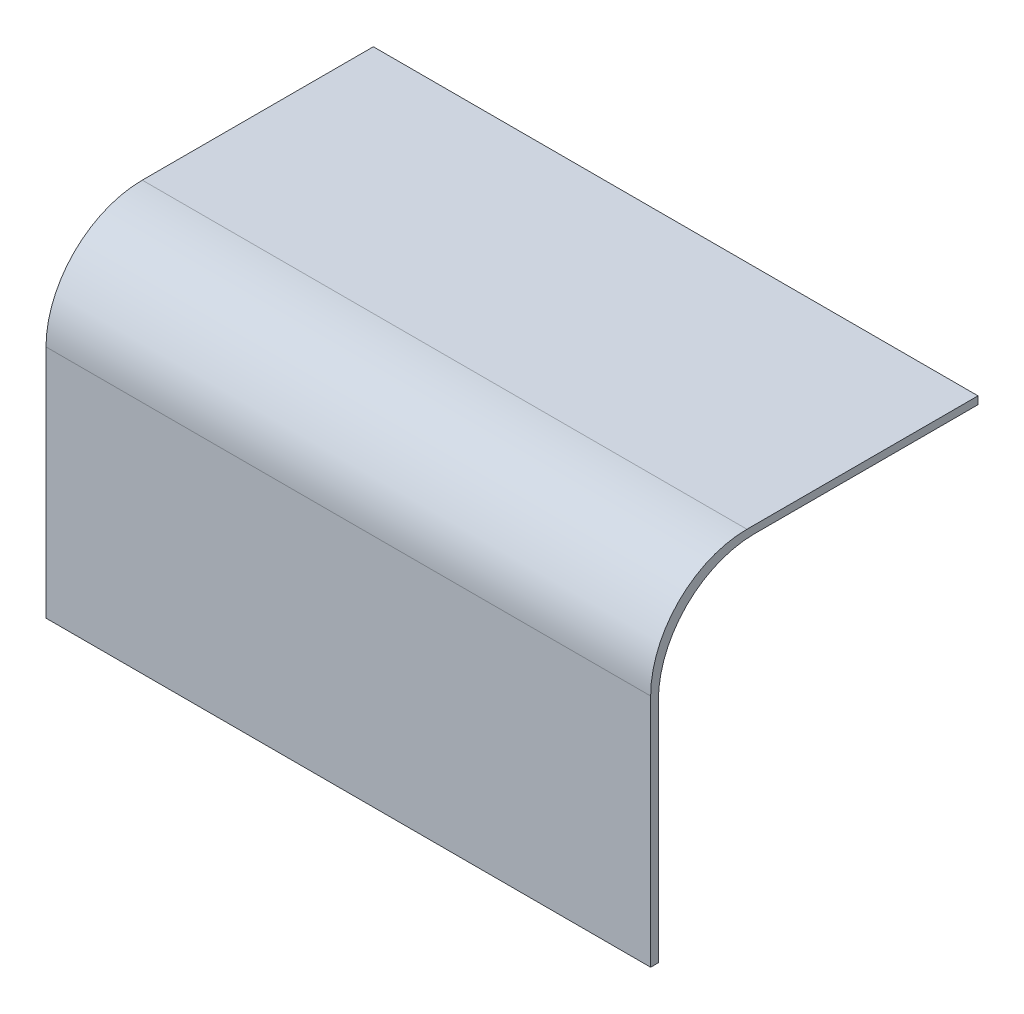
ISO-10303-21;
HEADER;
FILE_DESCRIPTION(('STEP AP214'),'2;1');
FILE_NAME('part.step','',(''),(''),'','','');
FILE_SCHEMA(('AUTOMOTIVE_DESIGN { 1 0 10303 214 1 1 1 1 }'));
ENDSEC;
DATA;
#1=APPLICATION_CONTEXT('core data for automotive mechanical design processes');
#2=APPLICATION_PROTOCOL_DEFINITION('international standard','automotive_design',2000,#1);
#3=PRODUCT_CONTEXT('',#1,'mechanical');
#4=PRODUCT('Part','Part','',(#3));
#5=PRODUCT_RELATED_PRODUCT_CATEGORY('part','',(#4));
#6=PRODUCT_DEFINITION_FORMATION('','',#4);
#7=PRODUCT_DEFINITION_CONTEXT('part definition',#1,'design');
#8=PRODUCT_DEFINITION('design','',#6,#7);
#9=PRODUCT_DEFINITION_SHAPE('','',#8);
#10=(LENGTH_UNIT() NAMED_UNIT(*) SI_UNIT(.MILLI.,.METRE.));
#11=(NAMED_UNIT(*) PLANE_ANGLE_UNIT() SI_UNIT($,.RADIAN.));
#12=(NAMED_UNIT(*) SI_UNIT($,.STERADIAN.) SOLID_ANGLE_UNIT());
#13=UNCERTAINTY_MEASURE_WITH_UNIT(LENGTH_MEASURE(1.E-05),#10,'distance_accuracy_value','');
#14=(GEOMETRIC_REPRESENTATION_CONTEXT(3) GLOBAL_UNCERTAINTY_ASSIGNED_CONTEXT((#13)) GLOBAL_UNIT_ASSIGNED_CONTEXT((#10,
#11,#12)) REPRESENTATION_CONTEXT('',''));
#15=CARTESIAN_POINT('',(0.,0.,0.));
#16=DIRECTION('',(0.,0.,1.));
#17=DIRECTION('',(1.,0.,0.));
#18=AXIS2_PLACEMENT_3D('',#15,#16,#17);
#19=CARTESIAN_POINT('',(-314.,97.591108672951,34.5721235394558));
#20=DIRECTION('',(0.,0.,-1.));
#21=DIRECTION('',(0.,1.,0.));
#22=AXIS2_PLACEMENT_3D('',#19,#20,#21);
#23=PLANE('',#22);
#24=DIRECTION('',(0.,1.,0.));
#25=VECTOR('',#24,1.);
#26=CARTESIAN_POINT('',(-5.99999999999998,-14.408891327049,34.5721235394558));
#27=LINE('',#26,#25);
#28=CARTESIAN_POINT('',(-5.99999999999998,-14.408891327049,34.5721235394558));
#29=VERTEX_POINT('',#28);
#30=CARTESIAN_POINT('',(-5.99999999999998,97.591108672951,34.5721235394558));
#31=VERTEX_POINT('',#30);
#32=EDGE_CURVE('E361',#29,#31,#27,.T.);
#33=ORIENTED_EDGE('',*,*,#32,.F.);
#34=DIRECTION('',(1.,0.,0.));
#35=VECTOR('',#34,1.);
#36=CARTESIAN_POINT('',(-308.,-14.408891327049,34.5721235394558));
#37=LINE('',#36,#35);
#38=CARTESIAN_POINT('',(-308.,-14.408891327049,34.5721235394558));
#39=VERTEX_POINT('',#38);
#40=EDGE_CURVE('E366',#39,#29,#37,.T.);
#41=ORIENTED_EDGE('',*,*,#40,.F.);
#42=DIRECTION('',(0.,-1.,0.));
#43=VECTOR('',#42,1.);
#44=CARTESIAN_POINT('',(-308.,97.591108672951,34.5721235394558));
#45=LINE('',#44,#43);
#46=CARTESIAN_POINT('',(-308.,97.591108672951,34.5721235394558));
#47=VERTEX_POINT('',#46);
#48=EDGE_CURVE('E396',#47,#39,#45,.T.);
#49=ORIENTED_EDGE('',*,*,#48,.F.);
#50=DIRECTION('',(1.,0.,0.));
#51=VECTOR('',#50,1.);
#52=CARTESIAN_POINT('',(-314.,97.591108672951,34.5721235394558));
#53=LINE('',#52,#51);
#54=EDGE_CURVE('E179',#47,#31,#53,.T.);
#55=ORIENTED_EDGE('',*,*,#54,.T.);
#56=EDGE_LOOP('',(#33,#41,#49,#55));
#57=FACE_BOUND('',#56,.T.);
#58=ADVANCED_FACE('F38',(#57),#23,.T.);
#59=CARTESIAN_POINT('',(-314.,-20.408891327049,34.5721235394558));
#60=DIRECTION('',(0.,-1.,0.));
#61=DIRECTION('',(0.,0.,-1.));
#62=AXIS2_PLACEMENT_3D('',#59,#60,#61);
#63=PLANE('',#62);
#64=DIRECTION('',(0.,0.,-1.));
#65=VECTOR('',#64,1.);
#66=CARTESIAN_POINT('',(0.,-20.408891327049,34.5721235394558));
#67=LINE('',#66,#65);
#68=CARTESIAN_POINT('',(0.,-20.408891327049,38.5721235394558));
#69=VERTEX_POINT('',#68);
#70=CARTESIAN_POINT('',(0.,-20.408891327049,34.5721235394558));
#71=VERTEX_POINT('',#70);
#72=EDGE_CURVE('E149',#69,#71,#67,.T.);
#73=ORIENTED_EDGE('',*,*,#72,.F.);
#74=DIRECTION('',(1.,0.,0.));
#75=VECTOR('',#74,1.);
#76=CARTESIAN_POINT('',(-314.,-20.408891327049,38.5721235394558));
#77=LINE('',#76,#75);
#78=CARTESIAN_POINT('',(-314.,-20.408891327049,38.5721235394558));
#79=VERTEX_POINT('',#78);
#80=EDGE_CURVE('E11',#79,#69,#77,.T.);
#81=ORIENTED_EDGE('',*,*,#80,.F.);
#82=DIRECTION('',(0.,0.,-1.));
#83=VECTOR('',#82,1.);
#84=CARTESIAN_POINT('',(-314.,-20.408891327049,34.5721235394558));
#85=LINE('',#84,#83);
#86=CARTESIAN_POINT('',(-314.,-20.408891327049,34.5721235394558));
#87=VERTEX_POINT('',#86);
#88=EDGE_CURVE('E170',#79,#87,#85,.T.);
#89=ORIENTED_EDGE('',*,*,#88,.T.);
#90=DIRECTION('',(1.,0.,0.));
#91=VECTOR('',#90,1.);
#92=CARTESIAN_POINT('',(-314.,-20.408891327049,34.5721235394558));
#93=LINE('',#92,#91);
#94=EDGE_CURVE('E42',#87,#71,#93,.T.);
#95=ORIENTED_EDGE('',*,*,#94,.T.);
#96=EDGE_LOOP('',(#73,#81,#89,#95));
#97=FACE_BOUND('',#96,.T.);
#98=ADVANCED_FACE('F40',(#97),#63,.T.);
#99=CARTESIAN_POINT('',(-314.,-20.408891327049,38.5721235394558));
#100=DIRECTION('',(0.,0.,1.));
#101=DIRECTION('',(1.,0.,0.));
#102=AXIS2_PLACEMENT_3D('',#99,#100,#101);
#103=PLANE('',#102);
#104=DIRECTION('',(0.,-1.,0.));
#105=VECTOR('',#104,1.);
#106=CARTESIAN_POINT('',(0.,-20.408891327049,38.5721235394558));
#107=LINE('',#106,#105);
#108=CARTESIAN_POINT('',(0.,101.591108672951,38.5721235394558));
#109=VERTEX_POINT('',#108);
#110=EDGE_CURVE('E168',#109,#69,#107,.T.);
#111=ORIENTED_EDGE('',*,*,#110,.F.);
#112=DIRECTION('',(1.,0.,0.));
#113=VECTOR('',#112,1.);
#114=CARTESIAN_POINT('',(-314.,101.591108672951,38.5721235394558));
#115=LINE('',#114,#113);
#116=CARTESIAN_POINT('',(-314.,101.591108672951,38.5721235394558));
#117=VERTEX_POINT('',#116);
#118=EDGE_CURVE('E47',#117,#109,#115,.T.);
#119=ORIENTED_EDGE('',*,*,#118,.F.);
#120=DIRECTION('',(0.,-1.,0.));
#121=VECTOR('',#120,1.);
#122=CARTESIAN_POINT('',(-314.,-20.408891327049,38.5721235394558));
#123=LINE('',#122,#121);
#124=EDGE_CURVE('E139',#117,#79,#123,.T.);
#125=ORIENTED_EDGE('',*,*,#124,.T.);
#126=ORIENTED_EDGE('',*,*,#80,.T.);
#127=EDGE_LOOP('',(#111,#119,#125,#126));
#128=FACE_BOUND('',#127,.T.);
#129=ADVANCED_FACE('F190',(#128),#103,.T.);
#130=CARTESIAN_POINT('',(-314.,101.591108672951,-11.4278764605442));
#131=DIRECTION('',(1.,0.,0.));
#132=DIRECTION('',(0.,0.,-1.));
#133=AXIS2_PLACEMENT_3D('',#130,#131,#132);
#134=CYLINDRICAL_SURFACE('',#133,50.);
#135=CARTESIAN_POINT('',(0.,101.591108672951,-11.4278764605442));
#136=DIRECTION('',(1.,0.,0.));
#137=DIRECTION('',(0.,0.,1.));
#138=AXIS2_PLACEMENT_3D('',#135,#136,#137);
#139=CIRCLE('',#138,50.);
#140=CARTESIAN_POINT('',(0.,151.591108672951,-11.4278764605442));
#141=VERTEX_POINT('',#140);
#142=EDGE_CURVE('E126',#141,#109,#139,.T.);
#143=ORIENTED_EDGE('',*,*,#142,.F.);
#144=DIRECTION('',(1.,0.,0.));
#145=VECTOR('',#144,1.);
#146=CARTESIAN_POINT('',(-314.,151.591108672951,-11.4278764605442));
#147=LINE('',#146,#145);
#148=CARTESIAN_POINT('',(-314.,151.591108672951,-11.4278764605442));
#149=VERTEX_POINT('',#148);
#150=EDGE_CURVE('E120',#149,#141,#147,.T.);
#151=ORIENTED_EDGE('',*,*,#150,.F.);
#152=CARTESIAN_POINT('',(-314.,101.591108672951,-11.4278764605442));
#153=DIRECTION('',(1.,0.,0.));
#154=DIRECTION('',(0.,0.,1.));
#155=AXIS2_PLACEMENT_3D('',#152,#153,#154);
#156=CIRCLE('',#155,50.);
#157=EDGE_CURVE('E123',#149,#117,#156,.T.);
#158=ORIENTED_EDGE('',*,*,#157,.T.);
#159=ORIENTED_EDGE('',*,*,#118,.T.);
#160=EDGE_LOOP('',(#143,#151,#158,#159));
#161=FACE_BOUND('',#160,.T.);
#162=ADVANCED_FACE('F122',(#161),#134,.T.);
#163=CARTESIAN_POINT('',(-314.,151.591108672951,-11.4278764605442));
#164=DIRECTION('',(0.,1.,0.));
#165=DIRECTION('',(0.,0.,1.));
#166=AXIS2_PLACEMENT_3D('',#163,#164,#165);
#167=PLANE('',#166);
#168=DIRECTION('',(0.,0.,1.));
#169=VECTOR('',#168,1.);
#170=CARTESIAN_POINT('',(0.,151.591108672951,-11.4278764605442));
#171=LINE('',#170,#169);
#172=CARTESIAN_POINT('',(0.,151.591108672951,-131.427876460544));
#173=VERTEX_POINT('',#172);
#174=EDGE_CURVE('E165',#173,#141,#171,.T.);
#175=ORIENTED_EDGE('',*,*,#174,.F.);
#176=DIRECTION('',(1.,0.,0.));
#177=VECTOR('',#176,1.);
#178=CARTESIAN_POINT('',(-314.,151.591108672951,-131.427876460544));
#179=LINE('',#178,#177);
#180=CARTESIAN_POINT('',(-314.,151.591108672951,-131.427876460544));
#181=VERTEX_POINT('',#180);
#182=EDGE_CURVE('E131',#181,#173,#179,.T.);
#183=ORIENTED_EDGE('',*,*,#182,.F.);
#184=DIRECTION('',(0.,0.,1.));
#185=VECTOR('',#184,1.);
#186=CARTESIAN_POINT('',(-314.,151.591108672951,-11.4278764605442));
#187=LINE('',#186,#185);
#188=EDGE_CURVE('E137',#181,#149,#187,.T.);
#189=ORIENTED_EDGE('',*,*,#188,.T.);
#190=ORIENTED_EDGE('',*,*,#150,.T.);
#191=EDGE_LOOP('',(#175,#183,#189,#190));
#192=FACE_BOUND('',#191,.T.);
#193=ADVANCED_FACE('F141',(#192),#167,.T.);
#194=CARTESIAN_POINT('',(-314.,151.591108672951,-131.427876460544));
#195=DIRECTION('',(0.,0.,-1.));
#196=DIRECTION('',(-1.,0.,0.));
#197=AXIS2_PLACEMENT_3D('',#194,#195,#196);
#198=PLANE('',#197);
#199=DIRECTION('',(0.,1.,0.));
#200=VECTOR('',#199,1.);
#201=CARTESIAN_POINT('',(0.,151.591108672951,-131.427876460544));
#202=LINE('',#201,#200);
#203=CARTESIAN_POINT('',(0.,147.591108672951,-131.427876460544));
#204=VERTEX_POINT('',#203);
#205=EDGE_CURVE('E162',#204,#173,#202,.T.);
#206=ORIENTED_EDGE('',*,*,#205,.F.);
#207=DIRECTION('',(1.,0.,0.));
#208=VECTOR('',#207,1.);
#209=CARTESIAN_POINT('',(-314.,147.591108672951,-131.427876460544));
#210=LINE('',#209,#208);
#211=CARTESIAN_POINT('',(-314.,147.591108672951,-131.427876460544));
#212=VERTEX_POINT('',#211);
#213=EDGE_CURVE('E174',#212,#204,#210,.T.);
#214=ORIENTED_EDGE('',*,*,#213,.F.);
#215=DIRECTION('',(0.,1.,0.));
#216=VECTOR('',#215,1.);
#217=CARTESIAN_POINT('',(-314.,151.591108672951,-131.427876460544));
#218=LINE('',#217,#216);
#219=EDGE_CURVE('E142',#212,#181,#218,.T.);
#220=ORIENTED_EDGE('',*,*,#219,.T.);
#221=ORIENTED_EDGE('',*,*,#182,.T.);
#222=EDGE_LOOP('',(#206,#214,#220,#221));
#223=FACE_BOUND('',#222,.T.);
#224=ADVANCED_FACE('F219',(#223),#198,.T.);
#225=CARTESIAN_POINT('',(-314.,147.591108672951,-131.427876460544));
#226=DIRECTION('',(0.,-1.,0.));
#227=DIRECTION('',(0.,0.,-1.));
#228=AXIS2_PLACEMENT_3D('',#225,#226,#227);
#229=PLANE('',#228);
#230=DIRECTION('',(0.,0.,-1.));
#231=VECTOR('',#230,1.);
#232=CARTESIAN_POINT('',(0.,147.591108672951,-131.427876460544));
#233=LINE('',#232,#231);
#234=CARTESIAN_POINT('',(0.,147.591108672951,-15.4278764605442));
#235=VERTEX_POINT('',#234);
#236=EDGE_CURVE('E159',#235,#204,#233,.T.);
#237=ORIENTED_EDGE('',*,*,#236,.F.);
#238=DIRECTION('',(1.,0.,0.));
#239=VECTOR('',#238,1.);
#240=CARTESIAN_POINT('',(-314.,147.591108672951,-15.4278764605442));
#241=LINE('',#240,#239);
#242=CARTESIAN_POINT('',(-314.,147.591108672951,-15.4278764605442));
#243=VERTEX_POINT('',#242);
#244=EDGE_CURVE('E176',#243,#235,#241,.T.);
#245=ORIENTED_EDGE('',*,*,#244,.F.);
#246=DIRECTION('',(0.,0.,-1.));
#247=VECTOR('',#246,1.);
#248=CARTESIAN_POINT('',(-314.,147.591108672951,-131.427876460544));
#249=LINE('',#248,#247);
#250=EDGE_CURVE('E144',#243,#212,#249,.T.);
#251=ORIENTED_EDGE('',*,*,#250,.T.);
#252=ORIENTED_EDGE('',*,*,#213,.T.);
#253=EDGE_LOOP('',(#237,#245,#251,#252));
#254=FACE_BOUND('',#253,.T.);
#255=ADVANCED_FACE('F214',(#254),#229,.T.);
#256=CARTESIAN_POINT('',(-314.,97.591108672951,-15.4278764605442));
#257=DIRECTION('',(1.,0.,0.));
#258=DIRECTION('',(0.,0.,-1.));
#259=AXIS2_PLACEMENT_3D('',#256,#257,#258);
#260=CYLINDRICAL_SURFACE('',#259,50.);
#261=CARTESIAN_POINT('',(0.,97.591108672951,-15.4278764605442));
#262=DIRECTION('',(-1.,0.,0.));
#263=DIRECTION('',(0.,0.,-1.));
#264=AXIS2_PLACEMENT_3D('',#261,#262,#263);
#265=CIRCLE('',#264,50.);
#266=CARTESIAN_POINT('',(0.,97.591108672951,34.5721235394558));
#267=VERTEX_POINT('',#266);
#268=EDGE_CURVE('E156',#267,#235,#265,.T.);
#269=ORIENTED_EDGE('',*,*,#268,.F.);
#270=CARTESIAN_POINT('',(-2.,97.591108672951,34.5721235394558));
#271=VERTEX_POINT('',#270);
#272=EDGE_CURVE('E180',#271,#267,#53,.T.);
#273=ORIENTED_EDGE('',*,*,#272,.F.);
#274=DIRECTION('',(1.,0.,0.));
#275=VECTOR('',#274,1.);
#276=CARTESIAN_POINT('',(-5.99999999999998,97.591108672951,34.5721235394558));
#277=LINE('',#276,#275);
#278=EDGE_CURVE('E55',#31,#271,#277,.T.);
#279=ORIENTED_EDGE('',*,*,#278,.F.);
#280=ORIENTED_EDGE('',*,*,#54,.F.);
#281=DIRECTION('',(1.,0.,0.));
#282=VECTOR('',#281,1.);
#283=CARTESIAN_POINT('',(-312.,97.591108672951,34.5721235394558));
#284=LINE('',#283,#282);
#285=CARTESIAN_POINT('',(-312.,97.591108672951,34.5721235394558));
#286=VERTEX_POINT('',#285);
#287=EDGE_CURVE('E393',#286,#47,#284,.T.);
#288=ORIENTED_EDGE('',*,*,#287,.F.);
#289=CARTESIAN_POINT('',(-314.,97.591108672951,34.5721235394558));
#290=VERTEX_POINT('',#289);
#291=EDGE_CURVE('E177',#290,#286,#53,.T.);
#292=ORIENTED_EDGE('',*,*,#291,.F.);
#293=CARTESIAN_POINT('',(-314.,97.591108672951,-15.4278764605442));
#294=DIRECTION('',(-1.,0.,0.));
#295=DIRECTION('',(0.,0.,-1.));
#296=AXIS2_PLACEMENT_3D('',#293,#294,#295);
#297=CIRCLE('',#296,50.);
#298=EDGE_CURVE('E424',#290,#243,#297,.T.);
#299=ORIENTED_EDGE('',*,*,#298,.T.);
#300=ORIENTED_EDGE('',*,*,#244,.T.);
#301=EDGE_LOOP('',(#269,#273,#279,#280,#288,#292,#299,#300));
#302=FACE_BOUND('',#301,.T.);
#303=ADVANCED_FACE('F208',(#302),#260,.F.);
#304=DIRECTION('',(0.,1.,0.));
#305=VECTOR('',#304,1.);
#306=CARTESIAN_POINT('',(-312.,-18.408891327049,34.5721235394558));
#307=LINE('',#306,#305);
#308=CARTESIAN_POINT('',(-312.,-18.408891327049,34.5721235394558));
#309=VERTEX_POINT('',#308);
#310=EDGE_CURVE('E390',#309,#286,#307,.T.);
#311=ORIENTED_EDGE('',*,*,#310,.F.);
#312=DIRECTION('',(-1.,0.,0.));
#313=VECTOR('',#312,1.);
#314=CARTESIAN_POINT('',(-2.,-18.408891327049,34.5721235394558));
#315=LINE('',#314,#313);
#316=CARTESIAN_POINT('',(-2.,-18.408891327049,34.5721235394558));
#317=VERTEX_POINT('',#316);
#318=EDGE_CURVE('E387',#317,#309,#315,.T.);
#319=ORIENTED_EDGE('',*,*,#318,.F.);
#320=DIRECTION('',(0.,-1.,0.));
#321=VECTOR('',#320,1.);
#322=CARTESIAN_POINT('',(-1.99999999999998,97.591108672951,34.5721235394558));
#323=LINE('',#322,#321);
#324=EDGE_CURVE('E384',#271,#317,#323,.T.);
#325=ORIENTED_EDGE('',*,*,#324,.F.);
#326=ORIENTED_EDGE('',*,*,#272,.T.);
#327=DIRECTION('',(0.,1.,0.));
#328=VECTOR('',#327,1.);
#329=CARTESIAN_POINT('',(0.,97.591108672951,34.5721235394558));
#330=LINE('',#329,#328);
#331=EDGE_CURVE('E152',#71,#267,#330,.T.);
#332=ORIENTED_EDGE('',*,*,#331,.F.);
#333=ORIENTED_EDGE('',*,*,#94,.F.);
#334=DIRECTION('',(0.,1.,0.));
#335=VECTOR('',#334,1.);
#336=CARTESIAN_POINT('',(-314.,97.591108672951,34.5721235394558));
#337=LINE('',#336,#335);
#338=EDGE_CURVE('E422',#87,#290,#337,.T.);
#339=ORIENTED_EDGE('',*,*,#338,.T.);
#340=ORIENTED_EDGE('',*,*,#291,.T.);
#341=EDGE_LOOP('',(#311,#319,#325,#326,#332,#333,#339,#340));
#342=FACE_BOUND('',#341,.T.);
#343=ADVANCED_FACE('F187',(#342),#23,.T.);
#344=CARTESIAN_POINT('',(-314.,101.591108672951,-11.4278764605442));
#345=DIRECTION('',(-1.,0.,0.));
#346=DIRECTION('',(0.,0.,1.));
#347=AXIS2_PLACEMENT_3D('',#344,#345,#346);
#348=PLANE('',#347);
#349=ORIENTED_EDGE('',*,*,#88,.F.);
#350=ORIENTED_EDGE('',*,*,#124,.F.);
#351=ORIENTED_EDGE('',*,*,#157,.F.);
#352=ORIENTED_EDGE('',*,*,#188,.F.);
#353=ORIENTED_EDGE('',*,*,#219,.F.);
#354=ORIENTED_EDGE('',*,*,#250,.F.);
#355=ORIENTED_EDGE('',*,*,#298,.F.);
#356=ORIENTED_EDGE('',*,*,#338,.F.);
#357=EDGE_LOOP('',(#349,#350,#351,#352,#353,#354,#355,#356));
#358=FACE_BOUND('',#357,.T.);
#359=ADVANCED_FACE('F135',(#358),#348,.T.);
#360=CARTESIAN_POINT('',(0.,101.591108672951,-11.4278764605442));
#361=DIRECTION('',(-1.,0.,0.));
#362=DIRECTION('',(0.,0.,1.));
#363=AXIS2_PLACEMENT_3D('',#360,#361,#362);
#364=PLANE('',#363);
#365=ORIENTED_EDGE('',*,*,#72,.T.);
#366=ORIENTED_EDGE('',*,*,#331,.T.);
#367=ORIENTED_EDGE('',*,*,#268,.T.);
#368=ORIENTED_EDGE('',*,*,#236,.T.);
#369=ORIENTED_EDGE('',*,*,#205,.T.);
#370=ORIENTED_EDGE('',*,*,#174,.T.);
#371=ORIENTED_EDGE('',*,*,#142,.T.);
#372=ORIENTED_EDGE('',*,*,#110,.T.);
#373=EDGE_LOOP('',(#365,#366,#367,#368,#369,#370,#371,#372));
#374=FACE_BOUND('',#373,.T.);
#375=ADVANCED_FACE('F189',(#374),#364,.F.);
#376=CARTESIAN_POINT('',(-5.99999999999998,97.591108672951,36.5721235394558));
#377=DIRECTION('',(0.,1.,0.));
#378=DIRECTION('',(0.,0.,1.));
#379=AXIS2_PLACEMENT_3D('',#376,#377,#378);
#380=PLANE('',#379);
#381=ORIENTED_EDGE('',*,*,#278,.T.);
#382=DIRECTION('',(0.,0.,-1.));
#383=VECTOR('',#382,1.);
#384=CARTESIAN_POINT('',(-1.99999999999998,97.591108672951,36.5721235394558));
#385=LINE('',#384,#383);
#386=CARTESIAN_POINT('',(-1.99999999999998,97.591108672951,36.5721235394558));
#387=VERTEX_POINT('',#386);
#388=EDGE_CURVE('E382',#387,#271,#385,.T.);
#389=ORIENTED_EDGE('',*,*,#388,.F.);
#390=DIRECTION('',(1.,0.,0.));
#391=VECTOR('',#390,1.);
#392=CARTESIAN_POINT('',(-5.99999999999998,97.591108672951,36.5721235394558));
#393=LINE('',#392,#391);
#394=CARTESIAN_POINT('',(-5.99999999999998,97.591108672951,36.5721235394558));
#395=VERTEX_POINT('',#394);
#396=EDGE_CURVE('E352',#395,#387,#393,.T.);
#397=ORIENTED_EDGE('',*,*,#396,.F.);
#398=DIRECTION('',(0.,0.,-1.));
#399=VECTOR('',#398,1.);
#400=CARTESIAN_POINT('',(-5.99999999999998,97.591108672951,36.5721235394558));
#401=LINE('',#400,#399);
#402=EDGE_CURVE('E153',#395,#31,#401,.T.);
#403=ORIENTED_EDGE('',*,*,#402,.T.);
#404=EDGE_LOOP('',(#381,#389,#397,#403));
#405=FACE_BOUND('',#404,.T.);
#406=ADVANCED_FACE('F251',(#405),#380,.F.);
#407=CARTESIAN_POINT('',(-5.99999999999998,-14.408891327049,36.5721235394558));
#408=DIRECTION('',(-1.,0.,0.));
#409=DIRECTION('',(0.,0.,1.));
#410=AXIS2_PLACEMENT_3D('',#407,#408,#409);
#411=PLANE('',#410);
#412=ORIENTED_EDGE('',*,*,#32,.T.);
#413=ORIENTED_EDGE('',*,*,#402,.F.);
#414=DIRECTION('',(0.,1.,0.));
#415=VECTOR('',#414,1.);
#416=CARTESIAN_POINT('',(-5.99999999999998,-14.408891327049,36.5721235394558));
#417=LINE('',#416,#415);
#418=CARTESIAN_POINT('',(-5.99999999999998,-14.408891327049,36.5721235394558));
#419=VERTEX_POINT('',#418);
#420=EDGE_CURVE('E359',#419,#395,#417,.T.);
#421=ORIENTED_EDGE('',*,*,#420,.F.);
#422=DIRECTION('',(0.,0.,-1.));
#423=VECTOR('',#422,1.);
#424=CARTESIAN_POINT('',(-5.99999999999998,-14.408891327049,36.5721235394558));
#425=LINE('',#424,#423);
#426=EDGE_CURVE('E402',#419,#29,#425,.T.);
#427=ORIENTED_EDGE('',*,*,#426,.T.);
#428=EDGE_LOOP('',(#412,#413,#421,#427));
#429=FACE_BOUND('',#428,.T.);
#430=ADVANCED_FACE('F265',(#429),#411,.F.);
#431=CARTESIAN_POINT('',(-308.,-14.408891327049,36.5721235394558));
#432=DIRECTION('',(0.,1.,0.));
#433=DIRECTION('',(-1.,0.,0.));
#434=AXIS2_PLACEMENT_3D('',#431,#432,#433);
#435=PLANE('',#434);
#436=ORIENTED_EDGE('',*,*,#40,.T.);
#437=ORIENTED_EDGE('',*,*,#426,.F.);
#438=DIRECTION('',(1.,0.,0.));
#439=VECTOR('',#438,1.);
#440=CARTESIAN_POINT('',(-308.,-14.408891327049,36.5721235394558));
#441=LINE('',#440,#439);
#442=CARTESIAN_POINT('',(-308.,-14.408891327049,36.5721235394558));
#443=VERTEX_POINT('',#442);
#444=EDGE_CURVE('E379',#443,#419,#441,.T.);
#445=ORIENTED_EDGE('',*,*,#444,.F.);
#446=DIRECTION('',(0.,0.,-1.));
#447=VECTOR('',#446,1.);
#448=CARTESIAN_POINT('',(-308.,-14.408891327049,36.5721235394558));
#449=LINE('',#448,#447);
#450=EDGE_CURVE('E405',#443,#39,#449,.T.);
#451=ORIENTED_EDGE('',*,*,#450,.T.);
#452=EDGE_LOOP('',(#436,#437,#445,#451));
#453=FACE_BOUND('',#452,.T.);
#454=ADVANCED_FACE('F274',(#453),#435,.F.);
#455=CARTESIAN_POINT('',(-308.,97.591108672951,36.5721235394558));
#456=DIRECTION('',(1.,0.,0.));
#457=DIRECTION('',(0.,0.,-1.));
#458=AXIS2_PLACEMENT_3D('',#455,#456,#457);
#459=PLANE('',#458);
#460=ORIENTED_EDGE('',*,*,#48,.T.);
#461=ORIENTED_EDGE('',*,*,#450,.F.);
#462=DIRECTION('',(0.,-1.,0.));
#463=VECTOR('',#462,1.);
#464=CARTESIAN_POINT('',(-308.,97.591108672951,36.5721235394558));
#465=LINE('',#464,#463);
#466=CARTESIAN_POINT('',(-308.,97.591108672951,36.5721235394558));
#467=VERTEX_POINT('',#466);
#468=EDGE_CURVE('E376',#467,#443,#465,.T.);
#469=ORIENTED_EDGE('',*,*,#468,.F.);
#470=DIRECTION('',(0.,0.,-1.));
#471=VECTOR('',#470,1.);
#472=CARTESIAN_POINT('',(-308.,97.591108672951,36.5721235394558));
#473=LINE('',#472,#471);
#474=EDGE_CURVE('E408',#467,#47,#473,.T.);
#475=ORIENTED_EDGE('',*,*,#474,.T.);
#476=EDGE_LOOP('',(#460,#461,#469,#475));
#477=FACE_BOUND('',#476,.T.);
#478=ADVANCED_FACE('F284',(#477),#459,.F.);
#479=CARTESIAN_POINT('',(-312.,97.591108672951,36.5721235394558));
#480=DIRECTION('',(0.,1.,0.));
#481=DIRECTION('',(-1.,0.,0.));
#482=AXIS2_PLACEMENT_3D('',#479,#480,#481);
#483=PLANE('',#482);
#484=ORIENTED_EDGE('',*,*,#287,.T.);
#485=ORIENTED_EDGE('',*,*,#474,.F.);
#486=DIRECTION('',(1.,0.,0.));
#487=VECTOR('',#486,1.);
#488=CARTESIAN_POINT('',(-312.,97.591108672951,36.5721235394558));
#489=LINE('',#488,#487);
#490=CARTESIAN_POINT('',(-312.,97.591108672951,36.5721235394558));
#491=VERTEX_POINT('',#490);
#492=EDGE_CURVE('E373',#491,#467,#489,.T.);
#493=ORIENTED_EDGE('',*,*,#492,.F.);
#494=DIRECTION('',(0.,0.,-1.));
#495=VECTOR('',#494,1.);
#496=CARTESIAN_POINT('',(-312.,97.591108672951,36.5721235394558));
#497=LINE('',#496,#495);
#498=EDGE_CURVE('E411',#491,#286,#497,.T.);
#499=ORIENTED_EDGE('',*,*,#498,.T.);
#500=EDGE_LOOP('',(#484,#485,#493,#499));
#501=FACE_BOUND('',#500,.T.);
#502=ADVANCED_FACE('F294',(#501),#483,.F.);
#503=CARTESIAN_POINT('',(-312.,-18.408891327049,36.5721235394558));
#504=DIRECTION('',(-1.,0.,0.));
#505=DIRECTION('',(0.,0.,1.));
#506=AXIS2_PLACEMENT_3D('',#503,#504,#505);
#507=PLANE('',#506);
#508=ORIENTED_EDGE('',*,*,#310,.T.);
#509=ORIENTED_EDGE('',*,*,#498,.F.);
#510=DIRECTION('',(0.,1.,0.));
#511=VECTOR('',#510,1.);
#512=CARTESIAN_POINT('',(-312.,-18.408891327049,36.5721235394558));
#513=LINE('',#512,#511);
#514=CARTESIAN_POINT('',(-312.,-18.408891327049,36.5721235394558));
#515=VERTEX_POINT('',#514);
#516=EDGE_CURVE('E370',#515,#491,#513,.T.);
#517=ORIENTED_EDGE('',*,*,#516,.F.);
#518=DIRECTION('',(0.,0.,-1.));
#519=VECTOR('',#518,1.);
#520=CARTESIAN_POINT('',(-312.,-18.408891327049,36.5721235394558));
#521=LINE('',#520,#519);
#522=EDGE_CURVE('E414',#515,#309,#521,.T.);
#523=ORIENTED_EDGE('',*,*,#522,.T.);
#524=EDGE_LOOP('',(#508,#509,#517,#523));
#525=FACE_BOUND('',#524,.T.);
#526=ADVANCED_FACE('F304',(#525),#507,.F.);
#527=CARTESIAN_POINT('',(-2.,-18.408891327049,36.5721235394558));
#528=DIRECTION('',(0.,-1.,0.));
#529=DIRECTION('',(0.,0.,-1.));
#530=AXIS2_PLACEMENT_3D('',#527,#528,#529);
#531=PLANE('',#530);
#532=ORIENTED_EDGE('',*,*,#318,.T.);
#533=ORIENTED_EDGE('',*,*,#522,.F.);
#534=DIRECTION('',(-1.,0.,0.));
#535=VECTOR('',#534,1.);
#536=CARTESIAN_POINT('',(-2.,-18.408891327049,36.5721235394558));
#537=LINE('',#536,#535);
#538=CARTESIAN_POINT('',(-2.,-18.408891327049,36.5721235394558));
#539=VERTEX_POINT('',#538);
#540=EDGE_CURVE('E363',#539,#515,#537,.T.);
#541=ORIENTED_EDGE('',*,*,#540,.F.);
#542=DIRECTION('',(0.,0.,-1.));
#543=VECTOR('',#542,1.);
#544=CARTESIAN_POINT('',(-2.,-18.408891327049,36.5721235394558));
#545=LINE('',#544,#543);
#546=EDGE_CURVE('E417',#539,#317,#545,.T.);
#547=ORIENTED_EDGE('',*,*,#546,.T.);
#548=EDGE_LOOP('',(#532,#533,#541,#547));
#549=FACE_BOUND('',#548,.T.);
#550=ADVANCED_FACE('F314',(#549),#531,.F.);
#551=CARTESIAN_POINT('',(-1.99999999999998,97.591108672951,36.5721235394558));
#552=DIRECTION('',(1.,0.,0.));
#553=DIRECTION('',(0.,1.,0.));
#554=AXIS2_PLACEMENT_3D('',#551,#552,#553);
#555=PLANE('',#554);
#556=ORIENTED_EDGE('',*,*,#324,.T.);
#557=ORIENTED_EDGE('',*,*,#546,.F.);
#558=DIRECTION('',(0.,-1.,0.));
#559=VECTOR('',#558,1.);
#560=CARTESIAN_POINT('',(-1.99999999999998,97.591108672951,36.5721235394558));
#561=LINE('',#560,#559);
#562=EDGE_CURVE('E356',#387,#539,#561,.T.);
#563=ORIENTED_EDGE('',*,*,#562,.F.);
#564=ORIENTED_EDGE('',*,*,#388,.T.);
#565=EDGE_LOOP('',(#556,#557,#563,#564));
#566=FACE_BOUND('',#565,.T.);
#567=ADVANCED_FACE('F324',(#566),#555,.F.);
#568=CARTESIAN_POINT('',(0.,0.,36.5721235394558));
#569=DIRECTION('',(0.,0.,-1.));
#570=DIRECTION('',(0.,1.,0.));
#571=AXIS2_PLACEMENT_3D('',#568,#569,#570);
#572=PLANE('',#571);
#573=ORIENTED_EDGE('',*,*,#396,.T.);
#574=ORIENTED_EDGE('',*,*,#562,.T.);
#575=ORIENTED_EDGE('',*,*,#540,.T.);
#576=ORIENTED_EDGE('',*,*,#516,.T.);
#577=ORIENTED_EDGE('',*,*,#492,.T.);
#578=ORIENTED_EDGE('',*,*,#468,.T.);
#579=ORIENTED_EDGE('',*,*,#444,.T.);
#580=ORIENTED_EDGE('',*,*,#420,.T.);
#581=EDGE_LOOP('',(#573,#574,#575,#576,#577,#578,#579,#580));
#582=FACE_BOUND('',#581,.T.);
#583=ADVANCED_FACE('F334',(#582),#572,.T.);
#584=CLOSED_SHELL('',(#58,#98,#129,#162,#193,#224,#255,#303,#343,#359,#375,#406,#430,#454,#478,
#502,#526,#550,#567,#583));
#585=MANIFOLD_SOLID_BREP('B2',#584);
#586=ADVANCED_BREP_SHAPE_REPRESENTATION('',(#18,#585),#14);
#587=SHAPE_DEFINITION_REPRESENTATION(#9,#586);
ENDSEC;
END-ISO-10303-21;
